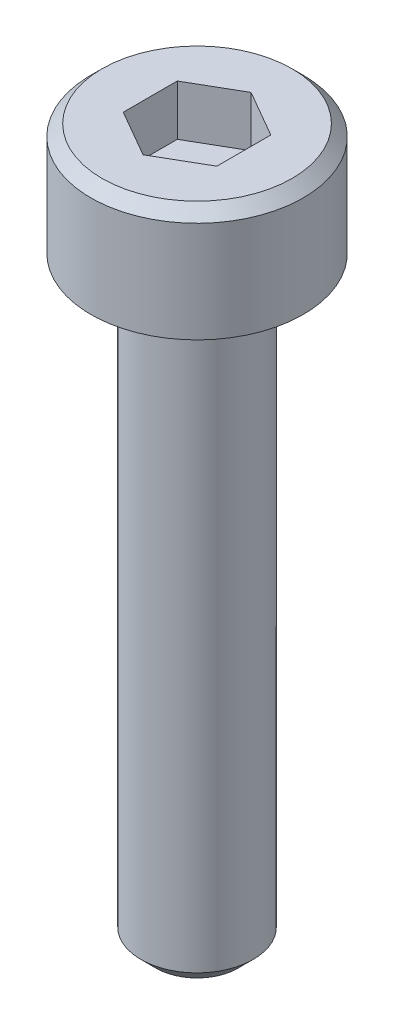
ISO-10303-21;
HEADER;
FILE_DESCRIPTION(('STEP AP214'),'2;1');
FILE_NAME('part.step','',(''),(''),'','','');
FILE_SCHEMA(('AUTOMOTIVE_DESIGN { 1 0 10303 214 1 1 1 1 }'));
ENDSEC;
DATA;
#1=APPLICATION_CONTEXT('core data for automotive mechanical design processes');
#2=APPLICATION_PROTOCOL_DEFINITION('international standard','automotive_design',2000,#1);
#3=PRODUCT_CONTEXT('',#1,'mechanical');
#4=PRODUCT('Part','Part','',(#3));
#5=PRODUCT_RELATED_PRODUCT_CATEGORY('part','',(#4));
#6=PRODUCT_DEFINITION_FORMATION('','',#4);
#7=PRODUCT_DEFINITION_CONTEXT('part definition',#1,'design');
#8=PRODUCT_DEFINITION('design','',#6,#7);
#9=PRODUCT_DEFINITION_SHAPE('','',#8);
#10=(LENGTH_UNIT() NAMED_UNIT(*) SI_UNIT(.MILLI.,.METRE.));
#11=(NAMED_UNIT(*) PLANE_ANGLE_UNIT() SI_UNIT($,.RADIAN.));
#12=(NAMED_UNIT(*) SI_UNIT($,.STERADIAN.) SOLID_ANGLE_UNIT());
#13=UNCERTAINTY_MEASURE_WITH_UNIT(LENGTH_MEASURE(1.E-05),#10,'distance_accuracy_value','');
#14=(GEOMETRIC_REPRESENTATION_CONTEXT(3) GLOBAL_UNCERTAINTY_ASSIGNED_CONTEXT((#13)) GLOBAL_UNIT_ASSIGNED_CONTEXT((#10,
#11,#12)) REPRESENTATION_CONTEXT('',''));
#15=CARTESIAN_POINT('',(0.,0.,0.));
#16=DIRECTION('',(0.,0.,1.));
#17=DIRECTION('',(1.,0.,0.));
#18=AXIS2_PLACEMENT_3D('',#15,#16,#17);
#19=CARTESIAN_POINT('',(0.,-16.,0.));
#20=DIRECTION('',(0.,-1.,0.));
#21=DIRECTION('',(0.,0.,-1.));
#22=AXIS2_PLACEMENT_3D('',#19,#20,#21);
#23=PLANE('',#22);
#24=CARTESIAN_POINT('',(0.,-16.,0.));
#25=DIRECTION('',(0.,-1.,0.));
#26=DIRECTION('',(0.,0.,-1.));
#27=AXIS2_PLACEMENT_3D('',#24,#25,#26);
#28=CIRCLE('',#27,1.1);
#29=CARTESIAN_POINT('',(0.,-16.,-1.1));
#30=VERTEX_POINT('',#29);
#31=EDGE_CURVE('E11',#30,#30,#28,.T.);
#32=ORIENTED_EDGE('',*,*,#31,.T.);
#33=EDGE_LOOP('',(#32));
#34=FACE_BOUND('',#33,.T.);
#35=ADVANCED_FACE('F41',(#34),#23,.T.);
#36=CARTESIAN_POINT('',(0.,-16.,0.));
#37=DIRECTION('',(0.,1.,0.));
#38=DIRECTION('',(0.,0.,1.));
#39=AXIS2_PLACEMENT_3D('',#36,#37,#38);
#40=CONICAL_SURFACE('',#39,1.1,0.785398163397449);
#41=CARTESIAN_POINT('',(0.,-15.6,0.));
#42=DIRECTION('',(0.,-1.,0.));
#43=DIRECTION('',(0.,0.,-1.));
#44=AXIS2_PLACEMENT_3D('',#41,#42,#43);
#45=CIRCLE('',#44,1.5);
#46=CARTESIAN_POINT('',(0.,-15.6,-1.5));
#47=VERTEX_POINT('',#46);
#48=EDGE_CURVE('E48',#47,#47,#45,.T.);
#49=ORIENTED_EDGE('',*,*,#48,.T.);
#50=EDGE_LOOP('',(#49));
#51=FACE_BOUND('',#50,.T.);
#52=ORIENTED_EDGE('',*,*,#31,.F.);
#53=EDGE_LOOP('',(#52));
#54=FACE_BOUND('',#53,.T.);
#55=ADVANCED_FACE('F161',(#51,#54),#40,.T.);
#56=CARTESIAN_POINT('',(0.,-10.,0.));
#57=DIRECTION('',(0.,-1.,0.));
#58=DIRECTION('',(0.,0.,-1.));
#59=AXIS2_PLACEMENT_3D('',#56,#57,#58);
#60=CYLINDRICAL_SURFACE('',#59,1.5);
#61=CARTESIAN_POINT('',(0.,0.,0.));
#62=DIRECTION('',(0.,-1.,0.));
#63=DIRECTION('',(0.,0.,-1.));
#64=AXIS2_PLACEMENT_3D('',#61,#62,#63);
#65=CIRCLE('',#64,1.5);
#66=CARTESIAN_POINT('',(0.,0.,-1.5));
#67=VERTEX_POINT('',#66);
#68=EDGE_CURVE('E156',#67,#67,#65,.T.);
#69=ORIENTED_EDGE('',*,*,#68,.T.);
#70=EDGE_LOOP('',(#69));
#71=FACE_BOUND('',#70,.T.);
#72=ORIENTED_EDGE('',*,*,#48,.F.);
#73=EDGE_LOOP('',(#72));
#74=FACE_BOUND('',#73,.T.);
#75=ADVANCED_FACE('F164',(#71,#74),#60,.T.);
#76=CARTESIAN_POINT('',(1.5,0.,0.));
#77=DIRECTION('',(0.,-1.,0.));
#78=DIRECTION('',(0.,0.,-1.));
#79=AXIS2_PLACEMENT_3D('',#76,#77,#78);
#80=PLANE('',#79);
#81=CARTESIAN_POINT('',(0.,0.,0.));
#82=DIRECTION('',(0.,-1.,0.));
#83=DIRECTION('',(0.,0.,-1.));
#84=AXIS2_PLACEMENT_3D('',#81,#82,#83);
#85=CIRCLE('',#84,2.84);
#86=CARTESIAN_POINT('',(0.,0.,-2.84));
#87=VERTEX_POINT('',#86);
#88=EDGE_CURVE('E153',#87,#87,#85,.T.);
#89=ORIENTED_EDGE('',*,*,#88,.T.);
#90=EDGE_LOOP('',(#89));
#91=FACE_BOUND('',#90,.T.);
#92=ORIENTED_EDGE('',*,*,#68,.F.);
#93=EDGE_LOOP('',(#92));
#94=FACE_BOUND('',#93,.T.);
#95=ADVANCED_FACE('F166',(#91,#94),#80,.T.);
#96=CARTESIAN_POINT('',(0.,-10.,0.));
#97=DIRECTION('',(0.,-1.,0.));
#98=DIRECTION('',(0.,0.,-1.));
#99=AXIS2_PLACEMENT_3D('',#96,#97,#98);
#100=CYLINDRICAL_SURFACE('',#99,2.84);
#101=CARTESIAN_POINT('',(0.,2.7,0.));
#102=DIRECTION('',(0.,-1.,0.));
#103=DIRECTION('',(0.,0.,-1.));
#104=AXIS2_PLACEMENT_3D('',#101,#102,#103);
#105=CIRCLE('',#104,2.84);
#106=CARTESIAN_POINT('',(0.,2.7,-2.84));
#107=VERTEX_POINT('',#106);
#108=EDGE_CURVE('E150',#107,#107,#105,.T.);
#109=ORIENTED_EDGE('',*,*,#108,.T.);
#110=EDGE_LOOP('',(#109));
#111=FACE_BOUND('',#110,.T.);
#112=ORIENTED_EDGE('',*,*,#88,.F.);
#113=EDGE_LOOP('',(#112));
#114=FACE_BOUND('',#113,.T.);
#115=ADVANCED_FACE('F172',(#111,#114),#100,.T.);
#116=CARTESIAN_POINT('',(0.,2.7,0.));
#117=DIRECTION('',(0.,-1.,0.));
#118=DIRECTION('',(0.,0.,-1.));
#119=AXIS2_PLACEMENT_3D('',#116,#117,#118);
#120=CONICAL_SURFACE('',#119,2.84,0.785398163397445);
#121=CARTESIAN_POINT('',(0.,3.,0.));
#122=DIRECTION('',(0.,-1.,0.));
#123=DIRECTION('',(0.,0.,-1.));
#124=AXIS2_PLACEMENT_3D('',#121,#122,#123);
#125=CIRCLE('',#124,2.54);
#126=CARTESIAN_POINT('',(0.,3.,-2.54));
#127=VERTEX_POINT('',#126);
#128=EDGE_CURVE('E142',#127,#127,#125,.T.);
#129=ORIENTED_EDGE('',*,*,#128,.T.);
#130=EDGE_LOOP('',(#129));
#131=FACE_BOUND('',#130,.T.);
#132=ORIENTED_EDGE('',*,*,#108,.F.);
#133=EDGE_LOOP('',(#132));
#134=FACE_BOUND('',#133,.T.);
#135=ADVANCED_FACE('F207',(#131,#134),#120,.T.);
#136=CARTESIAN_POINT('',(2.54,3.,0.));
#137=DIRECTION('',(0.,1.,0.));
#138=DIRECTION('',(0.,0.,1.));
#139=AXIS2_PLACEMENT_3D('',#136,#137,#138);
#140=PLANE('',#139);
#141=DIRECTION('',(0.,0.,-1.));
#142=VECTOR('',#141,1.);
#143=CARTESIAN_POINT('',(1.25,3.,-0.721687836487032));
#144=LINE('',#143,#142);
#145=CARTESIAN_POINT('',(1.25,3.,0.721687836487032));
#146=VERTEX_POINT('',#145);
#147=CARTESIAN_POINT('',(1.25,3.,-0.721687836487032));
#148=VERTEX_POINT('',#147);
#149=EDGE_CURVE('E55',#146,#148,#144,.T.);
#150=ORIENTED_EDGE('',*,*,#149,.F.);
#151=DIRECTION('',(0.866025403784439,0.,-0.5));
#152=VECTOR('',#151,1.);
#153=CARTESIAN_POINT('',(1.25,3.,0.721687836487032));
#154=LINE('',#153,#152);
#155=CARTESIAN_POINT('',(0.,3.,1.44337567297406));
#156=VERTEX_POINT('',#155);
#157=EDGE_CURVE('E138',#156,#146,#154,.T.);
#158=ORIENTED_EDGE('',*,*,#157,.F.);
#159=DIRECTION('',(0.866025403784439,0.,0.5));
#160=VECTOR('',#159,1.);
#161=CARTESIAN_POINT('',(0.,3.,1.44337567297406));
#162=LINE('',#161,#160);
#163=CARTESIAN_POINT('',(-1.25,3.,0.721687836487033));
#164=VERTEX_POINT('',#163);
#165=EDGE_CURVE('E136',#164,#156,#162,.T.);
#166=ORIENTED_EDGE('',*,*,#165,.F.);
#167=DIRECTION('',(0.,0.,1.));
#168=VECTOR('',#167,1.);
#169=CARTESIAN_POINT('',(-1.25,3.,0.721687836487033));
#170=LINE('',#169,#168);
#171=CARTESIAN_POINT('',(-1.25,3.,-0.721687836487032));
#172=VERTEX_POINT('',#171);
#173=EDGE_CURVE('E103',#172,#164,#170,.T.);
#174=ORIENTED_EDGE('',*,*,#173,.F.);
#175=DIRECTION('',(-0.866025403784438,0.,0.5));
#176=VECTOR('',#175,1.);
#177=CARTESIAN_POINT('',(-1.25,3.,-0.721687836487032));
#178=LINE('',#177,#176);
#179=CARTESIAN_POINT('',(0.,3.,-1.44337567297406));
#180=VERTEX_POINT('',#179);
#181=EDGE_CURVE('E132',#180,#172,#178,.T.);
#182=ORIENTED_EDGE('',*,*,#181,.F.);
#183=DIRECTION('',(-0.866025403784439,0.,-0.5));
#184=VECTOR('',#183,1.);
#185=CARTESIAN_POINT('',(0.,3.,-1.44337567297406));
#186=LINE('',#185,#184);
#187=EDGE_CURVE('E129',#148,#180,#186,.T.);
#188=ORIENTED_EDGE('',*,*,#187,.F.);
#189=EDGE_LOOP('',(#150,#158,#166,#174,#182,#188));
#190=FACE_BOUND('',#189,.T.);
#191=ORIENTED_EDGE('',*,*,#128,.F.);
#192=EDGE_LOOP('',(#191));
#193=FACE_BOUND('',#192,.T.);
#194=ADVANCED_FACE('F216',(#190,#193),#140,.T.);
#195=CARTESIAN_POINT('',(1.25,1.65,-0.721687836487032));
#196=DIRECTION('',(1.,0.,0.));
#197=DIRECTION('',(0.,0.,-1.));
#198=AXIS2_PLACEMENT_3D('',#195,#196,#197);
#199=PLANE('',#198);
#200=ORIENTED_EDGE('',*,*,#149,.T.);
#201=DIRECTION('',(0.,1.,0.));
#202=VECTOR('',#201,1.);
#203=CARTESIAN_POINT('',(1.25,1.65,-0.721687836487032));
#204=LINE('',#203,#202);
#205=CARTESIAN_POINT('',(1.25,1.65,-0.721687836487032));
#206=VERTEX_POINT('',#205);
#207=EDGE_CURVE('E85',#206,#148,#204,.T.);
#208=ORIENTED_EDGE('',*,*,#207,.F.);
#209=DIRECTION('',(0.,0.,-1.));
#210=VECTOR('',#209,1.);
#211=CARTESIAN_POINT('',(1.25,1.65,-0.721687836487032));
#212=LINE('',#211,#210);
#213=CARTESIAN_POINT('',(1.25,1.65,0.721687836487032));
#214=VERTEX_POINT('',#213);
#215=EDGE_CURVE('E140',#214,#206,#212,.T.);
#216=ORIENTED_EDGE('',*,*,#215,.F.);
#217=DIRECTION('',(0.,1.,0.));
#218=VECTOR('',#217,1.);
#219=CARTESIAN_POINT('',(1.25,1.65,0.721687836487032));
#220=LINE('',#219,#218);
#221=EDGE_CURVE('E63',#214,#146,#220,.T.);
#222=ORIENTED_EDGE('',*,*,#221,.T.);
#223=EDGE_LOOP('',(#200,#208,#216,#222));
#224=FACE_BOUND('',#223,.T.);
#225=ADVANCED_FACE('F225',(#224),#199,.F.);
#226=CARTESIAN_POINT('',(1.25,1.65,0.721687836487032));
#227=DIRECTION('',(0.5,0.,0.866025403784439));
#228=DIRECTION('',(0.866025403784439,0.,-0.5));
#229=AXIS2_PLACEMENT_3D('',#226,#227,#228);
#230=PLANE('',#229);
#231=ORIENTED_EDGE('',*,*,#157,.T.);
#232=ORIENTED_EDGE('',*,*,#221,.F.);
#233=DIRECTION('',(0.866025403784439,0.,-0.5));
#234=VECTOR('',#233,1.);
#235=CARTESIAN_POINT('',(1.25,1.65,0.721687836487032));
#236=LINE('',#235,#234);
#237=CARTESIAN_POINT('',(0.,1.65,1.44337567297406));
#238=VERTEX_POINT('',#237);
#239=EDGE_CURVE('E115',#238,#214,#236,.T.);
#240=ORIENTED_EDGE('',*,*,#239,.F.);
#241=DIRECTION('',(0.,1.,0.));
#242=VECTOR('',#241,1.);
#243=CARTESIAN_POINT('',(0.,1.65,1.44337567297406));
#244=LINE('',#243,#242);
#245=EDGE_CURVE('E107',#238,#156,#244,.T.);
#246=ORIENTED_EDGE('',*,*,#245,.T.);
#247=EDGE_LOOP('',(#231,#232,#240,#246));
#248=FACE_BOUND('',#247,.T.);
#249=ADVANCED_FACE('F234',(#248),#230,.F.);
#250=CARTESIAN_POINT('',(0.,1.65,1.44337567297406));
#251=DIRECTION('',(-0.5,0.,0.866025403784439));
#252=DIRECTION('',(0.866025403784439,0.,0.5));
#253=AXIS2_PLACEMENT_3D('',#250,#251,#252);
#254=PLANE('',#253);
#255=ORIENTED_EDGE('',*,*,#165,.T.);
#256=ORIENTED_EDGE('',*,*,#245,.F.);
#257=DIRECTION('',(0.866025403784439,0.,0.5));
#258=VECTOR('',#257,1.);
#259=CARTESIAN_POINT('',(0.,1.65,1.44337567297406));
#260=LINE('',#259,#258);
#261=CARTESIAN_POINT('',(-1.25,1.65,0.721687836487033));
#262=VERTEX_POINT('',#261);
#263=EDGE_CURVE('E111',#262,#238,#260,.T.);
#264=ORIENTED_EDGE('',*,*,#263,.F.);
#265=DIRECTION('',(0.,1.,0.));
#266=VECTOR('',#265,1.);
#267=CARTESIAN_POINT('',(-1.25,1.65,0.721687836487033));
#268=LINE('',#267,#266);
#269=EDGE_CURVE('E96',#262,#164,#268,.T.);
#270=ORIENTED_EDGE('',*,*,#269,.T.);
#271=EDGE_LOOP('',(#255,#256,#264,#270));
#272=FACE_BOUND('',#271,.T.);
#273=ADVANCED_FACE('F112',(#272),#254,.F.);
#274=CARTESIAN_POINT('',(-1.25,1.65,0.721687836487033));
#275=DIRECTION('',(-1.,0.,0.));
#276=DIRECTION('',(0.,0.,1.));
#277=AXIS2_PLACEMENT_3D('',#274,#275,#276);
#278=PLANE('',#277);
#279=ORIENTED_EDGE('',*,*,#173,.T.);
#280=ORIENTED_EDGE('',*,*,#269,.F.);
#281=DIRECTION('',(0.,0.,1.));
#282=VECTOR('',#281,1.);
#283=CARTESIAN_POINT('',(-1.25,1.65,0.721687836487033));
#284=LINE('',#283,#282);
#285=CARTESIAN_POINT('',(-1.25,1.65,-0.721687836487032));
#286=VERTEX_POINT('',#285);
#287=EDGE_CURVE('E100',#286,#262,#284,.T.);
#288=ORIENTED_EDGE('',*,*,#287,.F.);
#289=DIRECTION('',(0.,1.,0.));
#290=VECTOR('',#289,1.);
#291=CARTESIAN_POINT('',(-1.25,1.65,-0.721687836487032));
#292=LINE('',#291,#290);
#293=EDGE_CURVE('E108',#286,#172,#292,.T.);
#294=ORIENTED_EDGE('',*,*,#293,.T.);
#295=EDGE_LOOP('',(#279,#280,#288,#294));
#296=FACE_BOUND('',#295,.T.);
#297=ADVANCED_FACE('F98',(#296),#278,.F.);
#298=CARTESIAN_POINT('',(-1.25,1.65,-0.721687836487032));
#299=DIRECTION('',(-0.5,0.,-0.866025403784438));
#300=DIRECTION('',(-0.866025403784439,0.,0.5));
#301=AXIS2_PLACEMENT_3D('',#298,#299,#300);
#302=PLANE('',#301);
#303=ORIENTED_EDGE('',*,*,#181,.T.);
#304=ORIENTED_EDGE('',*,*,#293,.F.);
#305=DIRECTION('',(-0.866025403784438,0.,0.5));
#306=VECTOR('',#305,1.);
#307=CARTESIAN_POINT('',(-1.25,1.65,-0.721687836487032));
#308=LINE('',#307,#306);
#309=CARTESIAN_POINT('',(0.,1.65,-1.44337567297406));
#310=VERTEX_POINT('',#309);
#311=EDGE_CURVE('E121',#310,#286,#308,.T.);
#312=ORIENTED_EDGE('',*,*,#311,.F.);
#313=DIRECTION('',(0.,1.,0.));
#314=VECTOR('',#313,1.);
#315=CARTESIAN_POINT('',(0.,1.65,-1.44337567297406));
#316=LINE('',#315,#314);
#317=EDGE_CURVE('E145',#310,#180,#316,.T.);
#318=ORIENTED_EDGE('',*,*,#317,.T.);
#319=EDGE_LOOP('',(#303,#304,#312,#318));
#320=FACE_BOUND('',#319,.T.);
#321=ADVANCED_FACE('F256',(#320),#302,.F.);
#322=CARTESIAN_POINT('',(0.,1.65,-1.44337567297406));
#323=DIRECTION('',(0.5,0.,-0.866025403784439));
#324=DIRECTION('',(-0.866025403784439,0.,-0.5));
#325=AXIS2_PLACEMENT_3D('',#322,#323,#324);
#326=PLANE('',#325);
#327=ORIENTED_EDGE('',*,*,#187,.T.);
#328=ORIENTED_EDGE('',*,*,#317,.F.);
#329=DIRECTION('',(-0.866025403784439,0.,-0.5));
#330=VECTOR('',#329,1.);
#331=CARTESIAN_POINT('',(0.,1.65,-1.44337567297406));
#332=LINE('',#331,#330);
#333=EDGE_CURVE('E123',#206,#310,#332,.T.);
#334=ORIENTED_EDGE('',*,*,#333,.F.);
#335=ORIENTED_EDGE('',*,*,#207,.T.);
#336=EDGE_LOOP('',(#327,#328,#334,#335));
#337=FACE_BOUND('',#336,.T.);
#338=ADVANCED_FACE('F264',(#337),#326,.F.);
#339=CARTESIAN_POINT('',(0.,1.65,0.));
#340=DIRECTION('',(0.,-1.,0.));
#341=DIRECTION('',(0.,0.,-1.));
#342=AXIS2_PLACEMENT_3D('',#339,#340,#341);
#343=PLANE('',#342);
#344=ORIENTED_EDGE('',*,*,#215,.T.);
#345=ORIENTED_EDGE('',*,*,#333,.T.);
#346=ORIENTED_EDGE('',*,*,#311,.T.);
#347=ORIENTED_EDGE('',*,*,#287,.T.);
#348=ORIENTED_EDGE('',*,*,#263,.T.);
#349=ORIENTED_EDGE('',*,*,#239,.T.);
#350=EDGE_LOOP('',(#344,#345,#346,#347,#348,#349));
#351=FACE_BOUND('',#350,.T.);
#352=ADVANCED_FACE('F118',(#351),#343,.F.);
#353=CLOSED_SHELL('',(#35,#55,#75,#95,#115,#135,#194,#225,#249,#273,#297,#321,#338,#352));
#354=MANIFOLD_SOLID_BREP('B2',#353);
#355=ADVANCED_BREP_SHAPE_REPRESENTATION('',(#18,#354),#14);
#356=SHAPE_DEFINITION_REPRESENTATION(#9,#355);
ENDSEC;
END-ISO-10303-21;
